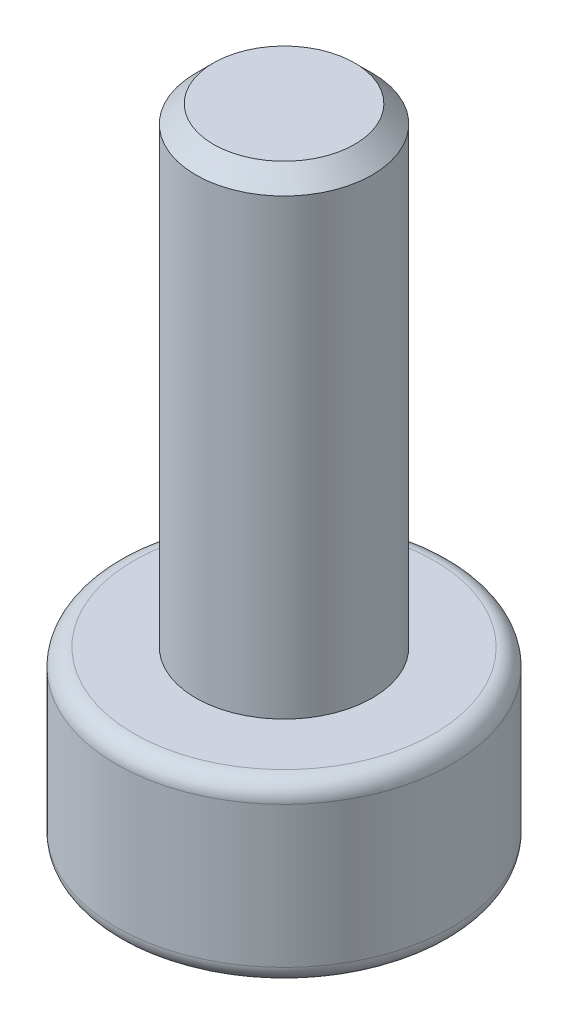
ISO-10303-21;
HEADER;
FILE_DESCRIPTION(('STEP AP214'),'2;1');
FILE_NAME('part.step','',(''),(''),'','','');
FILE_SCHEMA(('AUTOMOTIVE_DESIGN { 1 0 10303 214 1 1 1 1 }'));
ENDSEC;
DATA;
#1=APPLICATION_CONTEXT('core data for automotive mechanical design processes');
#2=APPLICATION_PROTOCOL_DEFINITION('international standard','automotive_design',2000,#1);
#3=PRODUCT_CONTEXT('',#1,'mechanical');
#4=PRODUCT('Part','Part','',(#3));
#5=PRODUCT_RELATED_PRODUCT_CATEGORY('part','',(#4));
#6=PRODUCT_DEFINITION_FORMATION('','',#4);
#7=PRODUCT_DEFINITION_CONTEXT('part definition',#1,'design');
#8=PRODUCT_DEFINITION('design','',#6,#7);
#9=PRODUCT_DEFINITION_SHAPE('','',#8);
#10=(LENGTH_UNIT() NAMED_UNIT(*) SI_UNIT(.MILLI.,.METRE.));
#11=(NAMED_UNIT(*) PLANE_ANGLE_UNIT() SI_UNIT($,.RADIAN.));
#12=(NAMED_UNIT(*) SI_UNIT($,.STERADIAN.) SOLID_ANGLE_UNIT());
#13=UNCERTAINTY_MEASURE_WITH_UNIT(LENGTH_MEASURE(1.E-05),#10,'distance_accuracy_value','');
#14=(GEOMETRIC_REPRESENTATION_CONTEXT(3) GLOBAL_UNCERTAINTY_ASSIGNED_CONTEXT((#13)) GLOBAL_UNIT_ASSIGNED_CONTEXT((#10,
#11,#12)) REPRESENTATION_CONTEXT('',''));
#15=CARTESIAN_POINT('',(0.,0.,0.));
#16=DIRECTION('',(0.,0.,1.));
#17=DIRECTION('',(1.,0.,0.));
#18=AXIS2_PLACEMENT_3D('',#15,#16,#17);
#19=CARTESIAN_POINT('',(0.,3.,0.));
#20=DIRECTION('',(0.,-1.,0.));
#21=DIRECTION('',(0.,0.,-1.));
#22=AXIS2_PLACEMENT_3D('',#19,#20,#21);
#23=CYLINDRICAL_SURFACE('',#22,2.85);
#24=CARTESIAN_POINT('',(0.,2.7,0.));
#25=DIRECTION('',(0.,1.,0.));
#26=DIRECTION('',(0.,0.,1.));
#27=AXIS2_PLACEMENT_3D('',#24,#25,#26);
#28=CIRCLE('',#27,2.85);
#29=CARTESIAN_POINT('',(0.,2.7,2.85));
#30=VERTEX_POINT('',#29);
#31=EDGE_CURVE('E68',#30,#30,#28,.F.);
#32=ORIENTED_EDGE('',*,*,#31,.T.);
#33=EDGE_LOOP('',(#32));
#34=FACE_BOUND('',#33,.T.);
#35=CARTESIAN_POINT('',(0.,0.3,0.));
#36=DIRECTION('',(0.,1.,0.));
#37=DIRECTION('',(0.,0.,1.));
#38=AXIS2_PLACEMENT_3D('',#35,#36,#37);
#39=CIRCLE('',#38,2.85);
#40=CARTESIAN_POINT('',(0.,0.3,2.85));
#41=VERTEX_POINT('',#40);
#42=EDGE_CURVE('E72',#41,#41,#39,.T.);
#43=ORIENTED_EDGE('',*,*,#42,.T.);
#44=EDGE_LOOP('',(#43));
#45=FACE_BOUND('',#44,.T.);
#46=ADVANCED_FACE('F39',(#34,#45),#23,.T.);
#47=CARTESIAN_POINT('',(0.,3.,0.));
#48=DIRECTION('',(0.,1.,0.));
#49=DIRECTION('',(0.,0.,1.));
#50=AXIS2_PLACEMENT_3D('',#47,#48,#49);
#51=PLANE('',#50);
#52=CARTESIAN_POINT('',(0.,3.,0.));
#53=DIRECTION('',(0.,1.,0.));
#54=DIRECTION('',(0.,0.,1.));
#55=AXIS2_PLACEMENT_3D('',#52,#53,#54);
#56=CIRCLE('',#55,2.55);
#57=CARTESIAN_POINT('',(0.,3.,2.55));
#58=VERTEX_POINT('',#57);
#59=EDGE_CURVE('E76',#58,#58,#56,.T.);
#60=ORIENTED_EDGE('',*,*,#59,.T.);
#61=EDGE_LOOP('',(#60));
#62=FACE_BOUND('',#61,.T.);
#63=CARTESIAN_POINT('',(0.,3.,0.));
#64=DIRECTION('',(0.,1.,0.));
#65=DIRECTION('',(0.,0.,1.));
#66=AXIS2_PLACEMENT_3D('',#63,#64,#65);
#67=CIRCLE('',#66,1.5);
#68=CARTESIAN_POINT('',(0.,3.,1.5));
#69=VERTEX_POINT('',#68);
#70=EDGE_CURVE('E80',#69,#69,#67,.T.);
#71=ORIENTED_EDGE('',*,*,#70,.F.);
#72=EDGE_LOOP('',(#71));
#73=FACE_BOUND('',#72,.T.);
#74=ADVANCED_FACE('F105',(#62,#73),#51,.T.);
#75=CARTESIAN_POINT('',(0.,0.,0.));
#76=DIRECTION('',(0.,1.,0.));
#77=DIRECTION('',(0.,0.,1.));
#78=AXIS2_PLACEMENT_3D('',#75,#76,#77);
#79=PLANE('',#78);
#80=CARTESIAN_POINT('',(0.,0.,0.));
#81=DIRECTION('',(0.,1.,0.));
#82=DIRECTION('',(0.,0.,1.));
#83=AXIS2_PLACEMENT_3D('',#80,#81,#82);
#84=CIRCLE('',#83,1.44);
#85=CARTESIAN_POINT('',(0.,0.,1.44));
#86=VERTEX_POINT('',#85);
#87=EDGE_CURVE('E10',#86,#86,#84,.T.);
#88=ORIENTED_EDGE('',*,*,#87,.T.);
#89=EDGE_LOOP('',(#88));
#90=FACE_BOUND('',#89,.T.);
#91=CARTESIAN_POINT('',(0.,0.,0.));
#92=DIRECTION('',(0.,1.,0.));
#93=DIRECTION('',(0.,0.,1.));
#94=AXIS2_PLACEMENT_3D('',#91,#92,#93);
#95=CIRCLE('',#94,2.55);
#96=CARTESIAN_POINT('',(0.,0.,2.55));
#97=VERTEX_POINT('',#96);
#98=EDGE_CURVE('E64',#97,#97,#95,.F.);
#99=ORIENTED_EDGE('',*,*,#98,.T.);
#100=EDGE_LOOP('',(#99));
#101=FACE_BOUND('',#100,.T.);
#102=ADVANCED_FACE('F111',(#90,#101),#79,.F.);
#103=CARTESIAN_POINT('',(0.,11.,0.));
#104=DIRECTION('',(0.,-1.,0.));
#105=DIRECTION('',(0.,0.,-1.));
#106=AXIS2_PLACEMENT_3D('',#103,#104,#105);
#107=CYLINDRICAL_SURFACE('',#106,1.5);
#108=CARTESIAN_POINT('',(0.,10.7,0.));
#109=DIRECTION('',(0.,1.,0.));
#110=DIRECTION('',(0.,0.,1.));
#111=AXIS2_PLACEMENT_3D('',#108,#109,#110);
#112=CIRCLE('',#111,1.5);
#113=CARTESIAN_POINT('',(0.,10.7,1.5));
#114=VERTEX_POINT('',#113);
#115=EDGE_CURVE('E53',#114,#114,#112,.F.);
#116=ORIENTED_EDGE('',*,*,#115,.T.);
#117=EDGE_LOOP('',(#116));
#118=FACE_BOUND('',#117,.T.);
#119=ORIENTED_EDGE('',*,*,#70,.T.);
#120=EDGE_LOOP('',(#119));
#121=FACE_BOUND('',#120,.T.);
#122=ADVANCED_FACE('F101',(#118,#121),#107,.T.);
#123=CARTESIAN_POINT('',(0.,11.,0.));
#124=DIRECTION('',(0.,1.,0.));
#125=DIRECTION('',(0.,0.,1.));
#126=AXIS2_PLACEMENT_3D('',#123,#124,#125);
#127=PLANE('',#126);
#128=CARTESIAN_POINT('',(0.,11.,0.));
#129=DIRECTION('',(0.,1.,0.));
#130=DIRECTION('',(0.,0.,1.));
#131=AXIS2_PLACEMENT_3D('',#128,#129,#130);
#132=CIRCLE('',#131,1.2);
#133=CARTESIAN_POINT('',(0.,11.,1.2));
#134=VERTEX_POINT('',#133);
#135=EDGE_CURVE('E58',#134,#134,#132,.T.);
#136=ORIENTED_EDGE('',*,*,#135,.T.);
#137=EDGE_LOOP('',(#136));
#138=FACE_BOUND('',#137,.T.);
#139=ADVANCED_FACE('F93',(#138),#127,.T.);
#140=CARTESIAN_POINT('',(0.,1.3,0.));
#141=DIRECTION('',(0.,-1.,0.));
#142=DIRECTION('',(0.,0.,-1.));
#143=AXIS2_PLACEMENT_3D('',#140,#141,#142);
#144=CYLINDRICAL_SURFACE('',#143,1.29);
#145=CARTESIAN_POINT('',(0.,0.15,0.));
#146=DIRECTION('',(0.,1.,0.));
#147=DIRECTION('',(0.,0.,1.));
#148=AXIS2_PLACEMENT_3D('',#145,#146,#147);
#149=CIRCLE('',#148,1.29);
#150=CARTESIAN_POINT('',(0.,0.15,1.29));
#151=VERTEX_POINT('',#150);
#152=EDGE_CURVE('E48',#151,#151,#149,.F.);
#153=ORIENTED_EDGE('',*,*,#152,.T.);
#154=EDGE_LOOP('',(#153));
#155=FACE_BOUND('',#154,.T.);
#156=CARTESIAN_POINT('',(0.,1.3,0.));
#157=DIRECTION('',(0.,-1.,0.));
#158=DIRECTION('',(0.,0.,-1.));
#159=AXIS2_PLACEMENT_3D('',#156,#157,#158);
#160=CIRCLE('',#159,1.29);
#161=CARTESIAN_POINT('',(0.,1.3,-1.29));
#162=VERTEX_POINT('',#161);
#163=EDGE_CURVE('E84',#162,#162,#160,.T.);
#164=ORIENTED_EDGE('',*,*,#163,.F.);
#165=EDGE_LOOP('',(#164));
#166=FACE_BOUND('',#165,.T.);
#167=ADVANCED_FACE('F91',(#155,#166),#144,.F.);
#168=CARTESIAN_POINT('',(0.,1.3,0.));
#169=DIRECTION('',(0.,-1.,0.));
#170=DIRECTION('',(0.,0.,-1.));
#171=AXIS2_PLACEMENT_3D('',#168,#169,#170);
#172=PLANE('',#171);
#173=ORIENTED_EDGE('',*,*,#163,.T.);
#174=EDGE_LOOP('',(#173));
#175=FACE_BOUND('',#174,.T.);
#176=ADVANCED_FACE('F89',(#175),#172,.T.);
#177=CARTESIAN_POINT('',(0.,2.7,0.));
#178=DIRECTION('',(0.,1.,0.));
#179=DIRECTION('',(0.,0.,1.));
#180=AXIS2_PLACEMENT_3D('',#177,#178,#179);
#181=TOROIDAL_SURFACE('',#180,2.55,0.3);
#182=ORIENTED_EDGE('',*,*,#31,.F.);
#183=EDGE_LOOP('',(#182));
#184=FACE_BOUND('',#183,.T.);
#185=ORIENTED_EDGE('',*,*,#59,.F.);
#186=EDGE_LOOP('',(#185));
#187=FACE_BOUND('',#186,.T.);
#188=ADVANCED_FACE('F99',(#184,#187),#181,.T.);
#189=CARTESIAN_POINT('',(0.,0.3,0.));
#190=DIRECTION('',(0.,1.,0.));
#191=DIRECTION('',(0.,0.,1.));
#192=AXIS2_PLACEMENT_3D('',#189,#190,#191);
#193=TOROIDAL_SURFACE('',#192,2.55,0.3);
#194=ORIENTED_EDGE('',*,*,#98,.F.);
#195=EDGE_LOOP('',(#194));
#196=FACE_BOUND('',#195,.T.);
#197=ORIENTED_EDGE('',*,*,#42,.F.);
#198=EDGE_LOOP('',(#197));
#199=FACE_BOUND('',#198,.T.);
#200=ADVANCED_FACE('F119',(#196,#199),#193,.T.);
#201=CARTESIAN_POINT('',(0.,11.,0.));
#202=DIRECTION('',(0.,-1.,0.));
#203=DIRECTION('',(0.,0.,-1.));
#204=AXIS2_PLACEMENT_3D('',#201,#202,#203);
#205=CONICAL_SURFACE('',#204,1.2,0.785398163397447);
#206=ORIENTED_EDGE('',*,*,#115,.F.);
#207=EDGE_LOOP('',(#206));
#208=FACE_BOUND('',#207,.T.);
#209=ORIENTED_EDGE('',*,*,#135,.F.);
#210=EDGE_LOOP('',(#209));
#211=FACE_BOUND('',#210,.T.);
#212=ADVANCED_FACE('F122',(#208,#211),#205,.T.);
#213=CARTESIAN_POINT('',(0.,0.15,0.));
#214=DIRECTION('',(0.,-1.,0.));
#215=DIRECTION('',(0.,0.,-1.));
#216=AXIS2_PLACEMENT_3D('',#213,#214,#215);
#217=CONICAL_SURFACE('',#216,1.29,0.78539816339745);
#218=ORIENTED_EDGE('',*,*,#87,.F.);
#219=EDGE_LOOP('',(#218));
#220=FACE_BOUND('',#219,.T.);
#221=ORIENTED_EDGE('',*,*,#152,.F.);
#222=EDGE_LOOP('',(#221));
#223=FACE_BOUND('',#222,.T.);
#224=ADVANCED_FACE('F42',(#220,#223),#217,.F.);
#225=CLOSED_SHELL('',(#46,#74,#102,#122,#139,#167,#176,#188,#200,#212,#224));
#226=MANIFOLD_SOLID_BREP('B2',#225);
#227=ADVANCED_BREP_SHAPE_REPRESENTATION('',(#18,#226),#14);
#228=SHAPE_DEFINITION_REPRESENTATION(#9,#227);
ENDSEC;
END-ISO-10303-21;
